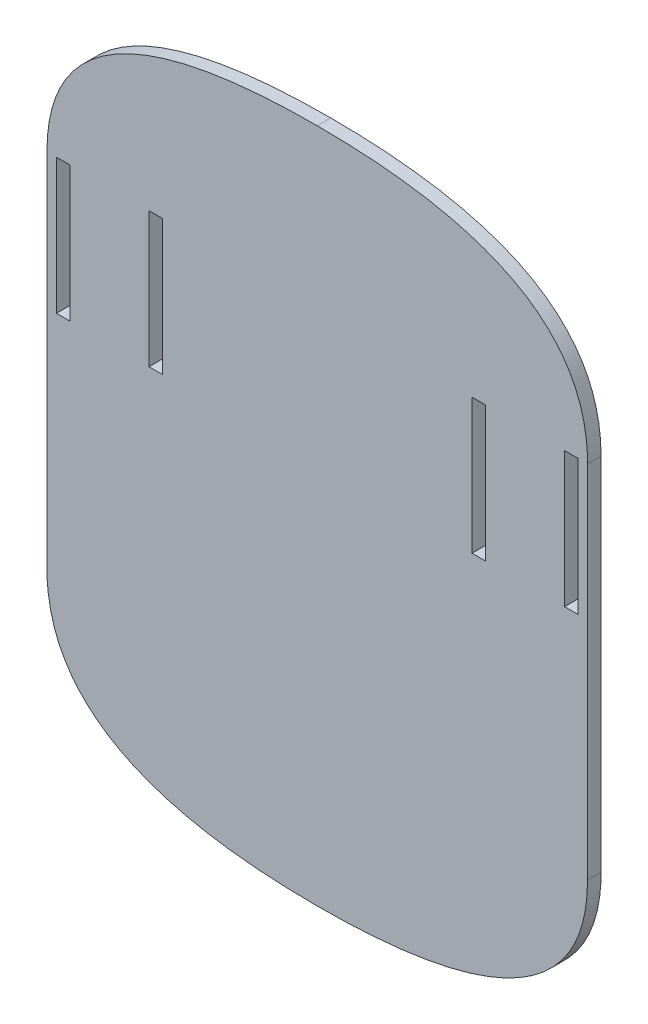
ISO-10303-21;
HEADER;
FILE_DESCRIPTION(('STEP AP214'),'2;1');
FILE_NAME('part.step','',(''),(''),'','','');
FILE_SCHEMA(('AUTOMOTIVE_DESIGN { 1 0 10303 214 1 1 1 1 }'));
ENDSEC;
DATA;
#1=APPLICATION_CONTEXT('core data for automotive mechanical design processes');
#2=APPLICATION_PROTOCOL_DEFINITION('international standard','automotive_design',2000,#1);
#3=PRODUCT_CONTEXT('',#1,'mechanical');
#4=PRODUCT('Part','Part','',(#3));
#5=PRODUCT_RELATED_PRODUCT_CATEGORY('part','',(#4));
#6=PRODUCT_DEFINITION_FORMATION('','',#4);
#7=PRODUCT_DEFINITION_CONTEXT('part definition',#1,'design');
#8=PRODUCT_DEFINITION('design','',#6,#7);
#9=PRODUCT_DEFINITION_SHAPE('','',#8);
#10=(LENGTH_UNIT() NAMED_UNIT(*) SI_UNIT(.MILLI.,.METRE.));
#11=(NAMED_UNIT(*) PLANE_ANGLE_UNIT() SI_UNIT($,.RADIAN.));
#12=(NAMED_UNIT(*) SI_UNIT($,.STERADIAN.) SOLID_ANGLE_UNIT());
#13=UNCERTAINTY_MEASURE_WITH_UNIT(LENGTH_MEASURE(1.E-05),#10,'distance_accuracy_value','');
#14=(GEOMETRIC_REPRESENTATION_CONTEXT(3) GLOBAL_UNCERTAINTY_ASSIGNED_CONTEXT((#13)) GLOBAL_UNIT_ASSIGNED_CONTEXT((#10,
#11,#12)) REPRESENTATION_CONTEXT('',''));
#15=CARTESIAN_POINT('',(0.,0.,0.));
#16=DIRECTION('',(0.,0.,1.));
#17=DIRECTION('',(1.,0.,0.));
#18=AXIS2_PLACEMENT_3D('',#15,#16,#17);
#19=CARTESIAN_POINT('',(0.,0.,5.08));
#20=DIRECTION('',(1.,0.,0.));
#21=DIRECTION('',(0.,0.,-1.));
#22=AXIS2_PLACEMENT_3D('',#19,#20,#21);
#23=PLANE('',#22);
#24=DIRECTION('',(0.,-1.,0.));
#25=VECTOR('',#24,1.);
#26=CARTESIAN_POINT('',(0.,0.,0.));
#27=LINE('',#26,#25);
#28=CARTESIAN_POINT('',(0.,194.733333333333,0.));
#29=VERTEX_POINT('',#28);
#30=CARTESIAN_POINT('',(0.,59.2666666666667,0.));
#31=VERTEX_POINT('',#30);
#32=EDGE_CURVE('E705',#29,#31,#27,.T.);
#33=ORIENTED_EDGE('',*,*,#32,.T.);
#34=CARTESIAN_POINT('',(0.,59.2666666666667,5.334));
#35=CARTESIAN_POINT('',(0.,59.2666666666667,3.47133333333333));
#36=CARTESIAN_POINT('',(0.,59.2666666666667,1.60866666666667));
#37=CARTESIAN_POINT('',(0.,59.2666666666667,-0.254));
#38=(BOUNDED_CURVE() B_SPLINE_CURVE(3,(#34,#35,#36,#37),.UNSPECIFIED.,.F.,
.F.) B_SPLINE_CURVE_WITH_KNOTS((4,4),(-0.000254,0.005334),
.UNSPECIFIED.) CURVE() GEOMETRIC_REPRESENTATION_ITEM() RATIONAL_B_SPLINE_CURVE((1.,1.,1.,1.)) REPRESENTATION_ITEM(''));
#39=CARTESIAN_POINT('',(0.,59.2666666666667,5.08));
#40=VERTEX_POINT('',#39);
#41=EDGE_CURVE('E574',#31,#40,#38,.F.);
#42=ORIENTED_EDGE('',*,*,#41,.T.);
#43=DIRECTION('',(0.,-1.,0.));
#44=VECTOR('',#43,1.);
#45=CARTESIAN_POINT('',(0.,0.,5.08));
#46=LINE('',#45,#44);
#47=CARTESIAN_POINT('',(0.,194.733333333333,5.08));
#48=VERTEX_POINT('',#47);
#49=EDGE_CURVE('E289',#48,#40,#46,.T.);
#50=ORIENTED_EDGE('',*,*,#49,.F.);
#51=CARTESIAN_POINT('',(0.,194.733333333333,-0.254));
#52=CARTESIAN_POINT('',(0.,194.733333333333,1.60866666666667));
#53=CARTESIAN_POINT('',(0.,194.733333333333,3.47133333333333));
#54=CARTESIAN_POINT('',(0.,194.733333333333,5.334));
#55=(BOUNDED_CURVE() B_SPLINE_CURVE(3,(#51,#52,#53,#54),.UNSPECIFIED.,.F.,
.F.) B_SPLINE_CURVE_WITH_KNOTS((4,4),(-0.000254,0.005334),
.UNSPECIFIED.) CURVE() GEOMETRIC_REPRESENTATION_ITEM() RATIONAL_B_SPLINE_CURVE((1.,1.,1.,1.)) REPRESENTATION_ITEM(''));
#56=EDGE_CURVE('E355',#48,#29,#55,.F.);
#57=ORIENTED_EDGE('',*,*,#56,.T.);
#58=EDGE_LOOP('',(#33,#42,#50,#57));
#59=FACE_BOUND('',#58,.T.);
#60=ADVANCED_FACE('F40',(#59),#23,.F.);
#61=CARTESIAN_POINT('',(203.2,0.,5.08));
#62=DIRECTION('',(-1.,0.,0.));
#63=DIRECTION('',(0.,0.,1.));
#64=AXIS2_PLACEMENT_3D('',#61,#62,#63);
#65=PLANE('',#64);
#66=DIRECTION('',(0.,1.,0.));
#67=VECTOR('',#66,1.);
#68=CARTESIAN_POINT('',(203.2,0.,5.08));
#69=LINE('',#68,#67);
#70=CARTESIAN_POINT('',(203.2,59.2666666666667,5.08));
#71=VERTEX_POINT('',#70);
#72=CARTESIAN_POINT('',(203.2,194.733333333333,5.08));
#73=VERTEX_POINT('',#72);
#74=EDGE_CURVE('E293',#71,#73,#69,.T.);
#75=ORIENTED_EDGE('',*,*,#74,.F.);
#76=CARTESIAN_POINT('',(203.2,59.2666666666667,-0.254));
#77=CARTESIAN_POINT('',(203.2,59.2666666666667,1.60866666666667));
#78=CARTESIAN_POINT('',(203.2,59.2666666666667,3.47133333333333));
#79=CARTESIAN_POINT('',(203.2,59.2666666666667,5.334));
#80=(BOUNDED_CURVE() B_SPLINE_CURVE(3,(#76,#77,#78,#79),.UNSPECIFIED.,.F.,
.F.) B_SPLINE_CURVE_WITH_KNOTS((4,4),(-0.000254,0.005334),
.UNSPECIFIED.) CURVE() GEOMETRIC_REPRESENTATION_ITEM() RATIONAL_B_SPLINE_CURVE((1.,1.,1.,1.)) REPRESENTATION_ITEM(''));
#81=CARTESIAN_POINT('',(203.2,59.2666666666667,0.));
#82=VERTEX_POINT('',#81);
#83=EDGE_CURVE('E401',#71,#82,#80,.F.);
#84=ORIENTED_EDGE('',*,*,#83,.T.);
#85=DIRECTION('',(0.,1.,0.));
#86=VECTOR('',#85,1.);
#87=CARTESIAN_POINT('',(203.2,0.,0.));
#88=LINE('',#87,#86);
#89=CARTESIAN_POINT('',(203.2,194.733333333333,0.));
#90=VERTEX_POINT('',#89);
#91=EDGE_CURVE('E294',#82,#90,#88,.T.);
#92=ORIENTED_EDGE('',*,*,#91,.T.);
#93=CARTESIAN_POINT('',(203.2,194.733333333333,5.334));
#94=CARTESIAN_POINT('',(203.2,194.733333333333,3.47133333333333));
#95=CARTESIAN_POINT('',(203.2,194.733333333333,1.60866666666667));
#96=CARTESIAN_POINT('',(203.2,194.733333333333,-0.254));
#97=(BOUNDED_CURVE() B_SPLINE_CURVE(3,(#93,#94,#95,#96),.UNSPECIFIED.,.F.,
.F.) B_SPLINE_CURVE_WITH_KNOTS((4,4),(-0.000254,0.005334),
.UNSPECIFIED.) CURVE() GEOMETRIC_REPRESENTATION_ITEM() RATIONAL_B_SPLINE_CURVE((1.,1.,1.,1.)) REPRESENTATION_ITEM(''));
#98=EDGE_CURVE('E534',#90,#73,#97,.F.);
#99=ORIENTED_EDGE('',*,*,#98,.T.);
#100=EDGE_LOOP('',(#75,#84,#92,#99));
#101=FACE_BOUND('',#100,.T.);
#102=ADVANCED_FACE('F318',(#101),#65,.F.);
#103=CARTESIAN_POINT('',(0.,0.,5.08));
#104=DIRECTION('',(0.,0.,-1.));
#105=DIRECTION('',(-1.,0.,0.));
#106=AXIS2_PLACEMENT_3D('',#103,#104,#105);
#107=PLANE('',#106);
#108=DIRECTION('',(1.,0.,0.));
#109=VECTOR('',#108,1.);
#110=CARTESIAN_POINT('',(3.55600000000001,143.933333333333,5.08));
#111=LINE('',#110,#109);
#112=CARTESIAN_POINT('',(3.55600000000001,143.933333333333,5.08));
#113=VERTEX_POINT('',#112);
#114=CARTESIAN_POINT('',(8.63600000000001,143.933333333333,5.08));
#115=VERTEX_POINT('',#114);
#116=EDGE_CURVE('E209',#113,#115,#111,.T.);
#117=ORIENTED_EDGE('',*,*,#116,.F.);
#118=DIRECTION('',(0.,-1.,0.));
#119=VECTOR('',#118,1.);
#120=CARTESIAN_POINT('',(3.556,194.733333333333,5.08));
#121=LINE('',#120,#119);
#122=CARTESIAN_POINT('',(3.556,194.733333333333,5.08));
#123=VERTEX_POINT('',#122);
#124=EDGE_CURVE('E59',#123,#113,#121,.T.);
#125=ORIENTED_EDGE('',*,*,#124,.F.);
#126=DIRECTION('',(-1.,0.,0.));
#127=VECTOR('',#126,1.);
#128=CARTESIAN_POINT('',(3.556,194.733333333333,5.08));
#129=LINE('',#128,#127);
#130=CARTESIAN_POINT('',(8.636,194.733333333333,5.08));
#131=VERTEX_POINT('',#130);
#132=EDGE_CURVE('E216',#131,#123,#129,.T.);
#133=ORIENTED_EDGE('',*,*,#132,.F.);
#134=DIRECTION('',(0.,1.,0.));
#135=VECTOR('',#134,1.);
#136=CARTESIAN_POINT('',(8.636,194.733333333333,5.08));
#137=LINE('',#136,#135);
#138=EDGE_CURVE('E199',#115,#131,#137,.T.);
#139=ORIENTED_EDGE('',*,*,#138,.F.);
#140=EDGE_LOOP('',(#117,#125,#133,#139));
#141=FACE_BOUND('',#140,.T.);
#142=DIRECTION('',(1.,0.,0.));
#143=VECTOR('',#142,1.);
#144=CARTESIAN_POINT('',(159.766,143.933333333333,5.08));
#145=LINE('',#144,#143);
#146=CARTESIAN_POINT('',(159.766,143.933333333333,5.08));
#147=VERTEX_POINT('',#146);
#148=CARTESIAN_POINT('',(164.846,143.933333333333,5.08));
#149=VERTEX_POINT('',#148);
#150=EDGE_CURVE('E227',#147,#149,#145,.T.);
#151=ORIENTED_EDGE('',*,*,#150,.F.);
#152=DIRECTION('',(0.,-1.,0.));
#153=VECTOR('',#152,1.);
#154=CARTESIAN_POINT('',(159.766,194.733333333333,5.08));
#155=LINE('',#154,#153);
#156=CARTESIAN_POINT('',(159.766,194.733333333333,5.08));
#157=VERTEX_POINT('',#156);
#158=EDGE_CURVE('E67',#157,#147,#155,.T.);
#159=ORIENTED_EDGE('',*,*,#158,.F.);
#160=DIRECTION('',(-1.,0.,0.));
#161=VECTOR('',#160,1.);
#162=CARTESIAN_POINT('',(159.766,194.733333333333,5.08));
#163=LINE('',#162,#161);
#164=CARTESIAN_POINT('',(164.846,194.733333333333,5.08));
#165=VERTEX_POINT('',#164);
#166=EDGE_CURVE('E233',#165,#157,#163,.T.);
#167=ORIENTED_EDGE('',*,*,#166,.F.);
#168=DIRECTION('',(0.,1.,0.));
#169=VECTOR('',#168,1.);
#170=CARTESIAN_POINT('',(164.846,194.733333333333,5.08));
#171=LINE('',#170,#169);
#172=EDGE_CURVE('E230',#149,#165,#171,.T.);
#173=ORIENTED_EDGE('',*,*,#172,.F.);
#174=EDGE_LOOP('',(#151,#159,#167,#173));
#175=FACE_BOUND('',#174,.T.);
#176=DIRECTION('',(1.,0.,0.));
#177=VECTOR('',#176,1.);
#178=CARTESIAN_POINT('',(38.354,143.933333333333,5.08));
#179=LINE('',#178,#177);
#180=CARTESIAN_POINT('',(38.354,143.933333333333,5.08));
#181=VERTEX_POINT('',#180);
#182=CARTESIAN_POINT('',(43.434,143.933333333333,5.08));
#183=VERTEX_POINT('',#182);
#184=EDGE_CURVE('E267',#181,#183,#179,.T.);
#185=ORIENTED_EDGE('',*,*,#184,.F.);
#186=DIRECTION('',(0.,-1.,0.));
#187=VECTOR('',#186,1.);
#188=CARTESIAN_POINT('',(38.354,194.733333333333,5.08));
#189=LINE('',#188,#187);
#190=CARTESIAN_POINT('',(38.354,194.733333333333,5.08));
#191=VERTEX_POINT('',#190);
#192=EDGE_CURVE('E239',#191,#181,#189,.T.);
#193=ORIENTED_EDGE('',*,*,#192,.F.);
#194=DIRECTION('',(-1.,0.,0.));
#195=VECTOR('',#194,1.);
#196=CARTESIAN_POINT('',(38.354,194.733333333333,5.08));
#197=LINE('',#196,#195);
#198=CARTESIAN_POINT('',(43.434,194.733333333333,5.08));
#199=VERTEX_POINT('',#198);
#200=EDGE_CURVE('E273',#199,#191,#197,.T.);
#201=ORIENTED_EDGE('',*,*,#200,.F.);
#202=DIRECTION('',(0.,1.,0.));
#203=VECTOR('',#202,1.);
#204=CARTESIAN_POINT('',(43.434,194.733333333333,5.08));
#205=LINE('',#204,#203);
#206=EDGE_CURVE('E270',#183,#199,#205,.T.);
#207=ORIENTED_EDGE('',*,*,#206,.F.);
#208=EDGE_LOOP('',(#185,#193,#201,#207));
#209=FACE_BOUND('',#208,.T.);
#210=DIRECTION('',(1.,0.,0.));
#211=VECTOR('',#210,1.);
#212=CARTESIAN_POINT('',(194.564,143.933333333333,5.08));
#213=LINE('',#212,#211);
#214=CARTESIAN_POINT('',(194.564,143.933333333333,5.08));
#215=VERTEX_POINT('',#214);
#216=CARTESIAN_POINT('',(199.644,143.933333333333,5.08));
#217=VERTEX_POINT('',#216);
#218=EDGE_CURVE('E247',#215,#217,#213,.T.);
#219=ORIENTED_EDGE('',*,*,#218,.F.);
#220=DIRECTION('',(0.,-1.,0.));
#221=VECTOR('',#220,1.);
#222=CARTESIAN_POINT('',(194.564,194.733333333333,5.08));
#223=LINE('',#222,#221);
#224=CARTESIAN_POINT('',(194.564,194.733333333333,5.08));
#225=VERTEX_POINT('',#224);
#226=EDGE_CURVE('E245',#225,#215,#223,.T.);
#227=ORIENTED_EDGE('',*,*,#226,.F.);
#228=DIRECTION('',(-1.,0.,0.));
#229=VECTOR('',#228,1.);
#230=CARTESIAN_POINT('',(194.564,194.733333333333,5.08));
#231=LINE('',#230,#229);
#232=CARTESIAN_POINT('',(199.644,194.733333333333,5.08));
#233=VERTEX_POINT('',#232);
#234=EDGE_CURVE('E254',#233,#225,#231,.T.);
#235=ORIENTED_EDGE('',*,*,#234,.F.);
#236=DIRECTION('',(0.,1.,0.));
#237=VECTOR('',#236,1.);
#238=CARTESIAN_POINT('',(199.644,194.733333333333,5.08));
#239=LINE('',#238,#237);
#240=EDGE_CURVE('E251',#217,#233,#239,.T.);
#241=ORIENTED_EDGE('',*,*,#240,.F.);
#242=EDGE_LOOP('',(#219,#227,#235,#241));
#243=FACE_BOUND('',#242,.T.);
#244=CARTESIAN_POINT('',(101.6,0.,5.08));
#245=CARTESIAN_POINT('',(0.,0.,5.08));
#246=CARTESIAN_POINT('',(0.,59.2666666666667,5.08));
#247=(BOUNDED_CURVE() B_SPLINE_CURVE(2,(#244,#245,#246),.UNSPECIFIED.,.F.,
.F.) B_SPLINE_CURVE_WITH_KNOTS((3,3),(0.,1.),
.UNSPECIFIED.) CURVE() GEOMETRIC_REPRESENTATION_ITEM() RATIONAL_B_SPLINE_CURVE((1.,1.,1.)) REPRESENTATION_ITEM(''));
#248=CARTESIAN_POINT('',(101.6,0.,5.08));
#249=VERTEX_POINT('',#248);
#250=EDGE_CURVE('E680',#40,#249,#247,.F.);
#251=ORIENTED_EDGE('',*,*,#250,.T.);
#252=CARTESIAN_POINT('',(203.2,59.2666666666667,5.08));
#253=CARTESIAN_POINT('',(203.2,0.,5.08));
#254=CARTESIAN_POINT('',(101.6,0.,5.08));
#255=(BOUNDED_CURVE() B_SPLINE_CURVE(2,(#252,#253,#254),.UNSPECIFIED.,.F.,
.F.) B_SPLINE_CURVE_WITH_KNOTS((3,3),(0.,1.),
.UNSPECIFIED.) CURVE() GEOMETRIC_REPRESENTATION_ITEM() RATIONAL_B_SPLINE_CURVE((1.,1.,1.)) REPRESENTATION_ITEM(''));
#256=EDGE_CURVE('E341',#249,#71,#255,.F.);
#257=ORIENTED_EDGE('',*,*,#256,.T.);
#258=ORIENTED_EDGE('',*,*,#74,.T.);
#259=CARTESIAN_POINT('',(101.6,254.,5.08));
#260=CARTESIAN_POINT('',(203.2,254.,5.08));
#261=CARTESIAN_POINT('',(203.2,194.733333333333,5.08));
#262=(BOUNDED_CURVE() B_SPLINE_CURVE(2,(#259,#260,#261),.UNSPECIFIED.,.F.,
.F.) B_SPLINE_CURVE_WITH_KNOTS((3,3),(0.,1.),
.UNSPECIFIED.) CURVE() GEOMETRIC_REPRESENTATION_ITEM() RATIONAL_B_SPLINE_CURVE((1.,1.,1.)) REPRESENTATION_ITEM(''));
#263=CARTESIAN_POINT('',(101.6,254.,5.08));
#264=VERTEX_POINT('',#263);
#265=EDGE_CURVE('E523',#73,#264,#262,.F.);
#266=ORIENTED_EDGE('',*,*,#265,.T.);
#267=CARTESIAN_POINT('',(0.,194.733333333333,5.08));
#268=CARTESIAN_POINT('',(0.,254.,5.08));
#269=CARTESIAN_POINT('',(101.6,254.,5.08));
#270=(BOUNDED_CURVE() B_SPLINE_CURVE(2,(#267,#268,#269),.UNSPECIFIED.,.F.,
.F.) B_SPLINE_CURVE_WITH_KNOTS((3,3),(0.,1.),
.UNSPECIFIED.) CURVE() GEOMETRIC_REPRESENTATION_ITEM() RATIONAL_B_SPLINE_CURVE((1.,1.,1.)) REPRESENTATION_ITEM(''));
#271=EDGE_CURVE('E302',#264,#48,#270,.F.);
#272=ORIENTED_EDGE('',*,*,#271,.T.);
#273=ORIENTED_EDGE('',*,*,#49,.T.);
#274=EDGE_LOOP('',(#251,#257,#258,#266,#272,#273));
#275=FACE_BOUND('',#274,.T.);
#276=ADVANCED_FACE('F213',(#141,#175,#209,#243,#275),#107,.F.);
#277=CARTESIAN_POINT('',(0.,0.,0.));
#278=DIRECTION('',(0.,0.,-1.));
#279=DIRECTION('',(-1.,0.,0.));
#280=AXIS2_PLACEMENT_3D('',#277,#278,#279);
#281=PLANE('',#280);
#282=DIRECTION('',(0.,1.,0.));
#283=VECTOR('',#282,1.);
#284=CARTESIAN_POINT('',(3.55600000000002,0.,0.));
#285=LINE('',#284,#283);
#286=CARTESIAN_POINT('',(3.55600000000001,143.933333333333,0.));
#287=VERTEX_POINT('',#286);
#288=CARTESIAN_POINT('',(3.556,194.733333333333,0.));
#289=VERTEX_POINT('',#288);
#290=EDGE_CURVE('E12',#287,#289,#285,.T.);
#291=ORIENTED_EDGE('',*,*,#290,.F.);
#292=DIRECTION('',(-1.,0.,0.));
#293=VECTOR('',#292,1.);
#294=CARTESIAN_POINT('',(0.,143.933333333333,0.));
#295=LINE('',#294,#293);
#296=CARTESIAN_POINT('',(8.63600000000001,143.933333333333,0.));
#297=VERTEX_POINT('',#296);
#298=EDGE_CURVE('E599',#297,#287,#295,.T.);
#299=ORIENTED_EDGE('',*,*,#298,.F.);
#300=DIRECTION('',(0.,-1.,0.));
#301=VECTOR('',#300,1.);
#302=CARTESIAN_POINT('',(8.63600000000003,0.,0.));
#303=LINE('',#302,#301);
#304=CARTESIAN_POINT('',(8.636,194.733333333333,0.));
#305=VERTEX_POINT('',#304);
#306=EDGE_CURVE('E202',#305,#297,#303,.T.);
#307=ORIENTED_EDGE('',*,*,#306,.F.);
#308=DIRECTION('',(1.,0.,0.));
#309=VECTOR('',#308,1.);
#310=CARTESIAN_POINT('',(0.,194.733333333333,0.));
#311=LINE('',#310,#309);
#312=EDGE_CURVE('E52',#289,#305,#311,.T.);
#313=ORIENTED_EDGE('',*,*,#312,.F.);
#314=EDGE_LOOP('',(#291,#299,#307,#313));
#315=FACE_BOUND('',#314,.T.);
#316=DIRECTION('',(0.,1.,0.));
#317=VECTOR('',#316,1.);
#318=CARTESIAN_POINT('',(159.766,0.,0.));
#319=LINE('',#318,#317);
#320=CARTESIAN_POINT('',(159.766,143.933333333333,0.));
#321=VERTEX_POINT('',#320);
#322=CARTESIAN_POINT('',(159.766,194.733333333333,0.));
#323=VERTEX_POINT('',#322);
#324=EDGE_CURVE('E597',#321,#323,#319,.T.);
#325=ORIENTED_EDGE('',*,*,#324,.F.);
#326=DIRECTION('',(-1.,0.,0.));
#327=VECTOR('',#326,1.);
#328=CARTESIAN_POINT('',(0.,143.933333333333,0.));
#329=LINE('',#328,#327);
#330=CARTESIAN_POINT('',(164.846,143.933333333333,0.));
#331=VERTEX_POINT('',#330);
#332=EDGE_CURVE('E590',#331,#321,#329,.T.);
#333=ORIENTED_EDGE('',*,*,#332,.F.);
#334=DIRECTION('',(0.,-1.,0.));
#335=VECTOR('',#334,1.);
#336=CARTESIAN_POINT('',(164.846,0.,0.));
#337=LINE('',#336,#335);
#338=CARTESIAN_POINT('',(164.846,194.733333333333,0.));
#339=VERTEX_POINT('',#338);
#340=EDGE_CURVE('E592',#339,#331,#337,.T.);
#341=ORIENTED_EDGE('',*,*,#340,.F.);
#342=DIRECTION('',(1.,0.,0.));
#343=VECTOR('',#342,1.);
#344=CARTESIAN_POINT('',(0.,194.733333333333,0.));
#345=LINE('',#344,#343);
#346=EDGE_CURVE('E595',#323,#339,#345,.T.);
#347=ORIENTED_EDGE('',*,*,#346,.F.);
#348=EDGE_LOOP('',(#325,#333,#341,#347));
#349=FACE_BOUND('',#348,.T.);
#350=DIRECTION('',(0.,1.,0.));
#351=VECTOR('',#350,1.);
#352=CARTESIAN_POINT('',(38.354,0.,0.));
#353=LINE('',#352,#351);
#354=CARTESIAN_POINT('',(38.354,143.933333333333,0.));
#355=VERTEX_POINT('',#354);
#356=CARTESIAN_POINT('',(38.354,194.733333333333,0.));
#357=VERTEX_POINT('',#356);
#358=EDGE_CURVE('E588',#355,#357,#353,.T.);
#359=ORIENTED_EDGE('',*,*,#358,.F.);
#360=DIRECTION('',(-1.,0.,0.));
#361=VECTOR('',#360,1.);
#362=CARTESIAN_POINT('',(0.,143.933333333333,0.));
#363=LINE('',#362,#361);
#364=CARTESIAN_POINT('',(43.434,143.933333333333,0.));
#365=VERTEX_POINT('',#364);
#366=EDGE_CURVE('E581',#365,#355,#363,.T.);
#367=ORIENTED_EDGE('',*,*,#366,.F.);
#368=DIRECTION('',(0.,-1.,0.));
#369=VECTOR('',#368,1.);
#370=CARTESIAN_POINT('',(43.434,0.,0.));
#371=LINE('',#370,#369);
#372=CARTESIAN_POINT('',(43.434,194.733333333333,0.));
#373=VERTEX_POINT('',#372);
#374=EDGE_CURVE('E583',#373,#365,#371,.T.);
#375=ORIENTED_EDGE('',*,*,#374,.F.);
#376=DIRECTION('',(1.,0.,0.));
#377=VECTOR('',#376,1.);
#378=CARTESIAN_POINT('',(0.,194.733333333333,0.));
#379=LINE('',#378,#377);
#380=EDGE_CURVE('E586',#357,#373,#379,.T.);
#381=ORIENTED_EDGE('',*,*,#380,.F.);
#382=EDGE_LOOP('',(#359,#367,#375,#381));
#383=FACE_BOUND('',#382,.T.);
#384=DIRECTION('',(0.,1.,0.));
#385=VECTOR('',#384,1.);
#386=CARTESIAN_POINT('',(194.564,0.,0.));
#387=LINE('',#386,#385);
#388=CARTESIAN_POINT('',(194.564,143.933333333333,0.));
#389=VERTEX_POINT('',#388);
#390=CARTESIAN_POINT('',(194.564,194.733333333333,0.));
#391=VERTEX_POINT('',#390);
#392=EDGE_CURVE('E579',#389,#391,#387,.T.);
#393=ORIENTED_EDGE('',*,*,#392,.F.);
#394=DIRECTION('',(-1.,0.,0.));
#395=VECTOR('',#394,1.);
#396=CARTESIAN_POINT('',(0.,143.933333333333,0.));
#397=LINE('',#396,#395);
#398=CARTESIAN_POINT('',(199.644,143.933333333333,0.));
#399=VERTEX_POINT('',#398);
#400=EDGE_CURVE('E566',#399,#389,#397,.T.);
#401=ORIENTED_EDGE('',*,*,#400,.F.);
#402=DIRECTION('',(0.,-1.,0.));
#403=VECTOR('',#402,1.);
#404=CARTESIAN_POINT('',(199.644,0.,0.));
#405=LINE('',#404,#403);
#406=CARTESIAN_POINT('',(199.644,194.733333333333,0.));
#407=VERTEX_POINT('',#406);
#408=EDGE_CURVE('E573',#407,#399,#405,.T.);
#409=ORIENTED_EDGE('',*,*,#408,.F.);
#410=DIRECTION('',(1.,0.,0.));
#411=VECTOR('',#410,1.);
#412=CARTESIAN_POINT('',(0.,194.733333333333,0.));
#413=LINE('',#412,#411);
#414=EDGE_CURVE('E577',#391,#407,#413,.T.);
#415=ORIENTED_EDGE('',*,*,#414,.F.);
#416=EDGE_LOOP('',(#393,#401,#409,#415));
#417=FACE_BOUND('',#416,.T.);
#418=ORIENTED_EDGE('',*,*,#91,.F.);
#419=CARTESIAN_POINT('',(101.6,0.,0.));
#420=CARTESIAN_POINT('',(203.2,0.,0.));
#421=CARTESIAN_POINT('',(203.2,59.2666666666667,0.));
#422=(BOUNDED_CURVE() B_SPLINE_CURVE(2,(#419,#420,#421),.UNSPECIFIED.,.F.,
.F.) B_SPLINE_CURVE_WITH_KNOTS((3,3),(0.,1.),
.UNSPECIFIED.) CURVE() GEOMETRIC_REPRESENTATION_ITEM() RATIONAL_B_SPLINE_CURVE((1.,1.,1.)) REPRESENTATION_ITEM(''));
#423=CARTESIAN_POINT('',(101.6,0.,0.));
#424=VERTEX_POINT('',#423);
#425=EDGE_CURVE('E390',#82,#424,#422,.F.);
#426=ORIENTED_EDGE('',*,*,#425,.T.);
#427=CARTESIAN_POINT('',(0.,59.2666666666667,0.));
#428=CARTESIAN_POINT('',(0.,0.,0.));
#429=CARTESIAN_POINT('',(101.6,0.,0.));
#430=(BOUNDED_CURVE() B_SPLINE_CURVE(2,(#427,#428,#429),.UNSPECIFIED.,.F.,
.F.) B_SPLINE_CURVE_WITH_KNOTS((3,3),(0.,1.),
.UNSPECIFIED.) CURVE() GEOMETRIC_REPRESENTATION_ITEM() RATIONAL_B_SPLINE_CURVE((1.,1.,1.)) REPRESENTATION_ITEM(''));
#431=EDGE_CURVE('E478',#424,#31,#430,.F.);
#432=ORIENTED_EDGE('',*,*,#431,.T.);
#433=ORIENTED_EDGE('',*,*,#32,.F.);
#434=CARTESIAN_POINT('',(101.6,254.,0.));
#435=CARTESIAN_POINT('',(0.,254.,0.));
#436=CARTESIAN_POINT('',(0.,194.733333333333,0.));
#437=(BOUNDED_CURVE() B_SPLINE_CURVE(2,(#434,#435,#436),.UNSPECIFIED.,.F.,
.F.) B_SPLINE_CURVE_WITH_KNOTS((3,3),(0.,1.),
.UNSPECIFIED.) CURVE() GEOMETRIC_REPRESENTATION_ITEM() RATIONAL_B_SPLINE_CURVE((1.,1.,1.)) REPRESENTATION_ITEM(''));
#438=CARTESIAN_POINT('',(101.6,254.,0.));
#439=VERTEX_POINT('',#438);
#440=EDGE_CURVE('E544',#29,#439,#437,.F.);
#441=ORIENTED_EDGE('',*,*,#440,.T.);
#442=CARTESIAN_POINT('',(203.2,194.733333333333,0.));
#443=CARTESIAN_POINT('',(203.2,254.,0.));
#444=CARTESIAN_POINT('',(101.6,254.,0.));
#445=(BOUNDED_CURVE() B_SPLINE_CURVE(2,(#442,#443,#444),.UNSPECIFIED.,.F.,
.F.) B_SPLINE_CURVE_WITH_KNOTS((3,3),(0.,1.),
.UNSPECIFIED.) CURVE() GEOMETRIC_REPRESENTATION_ITEM() RATIONAL_B_SPLINE_CURVE((1.,1.,1.)) REPRESENTATION_ITEM(''));
#446=EDGE_CURVE('E492',#439,#90,#445,.F.);
#447=ORIENTED_EDGE('',*,*,#446,.T.);
#448=EDGE_LOOP('',(#418,#426,#432,#433,#441,#447));
#449=FACE_BOUND('',#448,.T.);
#450=ADVANCED_FACE('F317',(#315,#349,#383,#417,#449),#281,.T.);
#451=CARTESIAN_POINT('',(101.6,0.,5.334));
#452=CARTESIAN_POINT('',(101.6,0.,3.47133333333333));
#453=CARTESIAN_POINT('',(101.6,0.,1.60866666666667));
#454=CARTESIAN_POINT('',(101.6,0.,-0.254));
#455=CARTESIAN_POINT('',(0.,0.,5.334));
#456=CARTESIAN_POINT('',(0.,0.,3.47133333333334));
#457=CARTESIAN_POINT('',(0.,0.,1.60866666666667));
#458=CARTESIAN_POINT('',(0.,0.,-0.254));
#459=CARTESIAN_POINT('',(0.,59.2666666666667,5.334));
#460=CARTESIAN_POINT('',(0.,59.2666666666667,3.47133333333333));
#461=CARTESIAN_POINT('',(0.,59.2666666666667,1.60866666666667));
#462=CARTESIAN_POINT('',(0.,59.2666666666667,-0.254));
#463=(BOUNDED_SURFACE() B_SPLINE_SURFACE(2,3,((#451,#452,#453,#454),(#455,#456,#457,#458),(#459,
#460,#461,#462)),.UNSPECIFIED.,.F.,.F.,.F.) B_SPLINE_SURFACE_WITH_KNOTS((3,3),(4,4),(0.,1.),
(-0.000254,0.005334),
.UNSPECIFIED.) GEOMETRIC_REPRESENTATION_ITEM() RATIONAL_B_SPLINE_SURFACE(((1.,1.,1.,1.),(1.,1.,
1.,1.),(1.,1.,1.,1.))) REPRESENTATION_ITEM('') SURFACE());
#464=CARTESIAN_POINT('',(101.6,0.,5.334));
#465=CARTESIAN_POINT('',(101.6,0.,3.47133333333333));
#466=CARTESIAN_POINT('',(101.6,0.,1.60866666666667));
#467=CARTESIAN_POINT('',(101.6,0.,-0.254));
#468=(BOUNDED_CURVE() B_SPLINE_CURVE(3,(#464,#465,#466,#467),.UNSPECIFIED.,.F.,
.F.) B_SPLINE_CURVE_WITH_KNOTS((4,4),(-0.000254,0.005334),
.UNSPECIFIED.) CURVE() GEOMETRIC_REPRESENTATION_ITEM() RATIONAL_B_SPLINE_CURVE((1.,1.,1.,1.)) REPRESENTATION_ITEM(''));
#469=EDGE_CURVE('E421',#249,#424,#468,.T.);
#470=ORIENTED_EDGE('',*,*,#469,.F.);
#471=ORIENTED_EDGE('',*,*,#250,.F.);
#472=ORIENTED_EDGE('',*,*,#41,.F.);
#473=ORIENTED_EDGE('',*,*,#431,.F.);
#474=EDGE_LOOP('',(#470,#471,#472,#473));
#475=FACE_BOUND('',#474,.T.);
#476=ADVANCED_FACE('F439',(#475),#463,.T.);
#477=CARTESIAN_POINT('',(203.2,59.2666666666667,5.334));
#478=CARTESIAN_POINT('',(203.2,59.2666666666667,3.47133333333333));
#479=CARTESIAN_POINT('',(203.2,59.2666666666667,1.60866666666667));
#480=CARTESIAN_POINT('',(203.2,59.2666666666667,-0.254));
#481=CARTESIAN_POINT('',(203.2,0.,5.334));
#482=CARTESIAN_POINT('',(203.2,0.,3.47133333333334));
#483=CARTESIAN_POINT('',(203.2,0.,1.60866666666667));
#484=CARTESIAN_POINT('',(203.2,0.,-0.254));
#485=CARTESIAN_POINT('',(101.6,0.,5.334));
#486=CARTESIAN_POINT('',(101.6,0.,3.47133333333333));
#487=CARTESIAN_POINT('',(101.6,0.,1.60866666666667));
#488=CARTESIAN_POINT('',(101.6,0.,-0.254));
#489=(BOUNDED_SURFACE() B_SPLINE_SURFACE(2,3,((#477,#478,#479,#480),(#481,#482,#483,#484),(#485,
#486,#487,#488)),.UNSPECIFIED.,.F.,.F.,.F.) B_SPLINE_SURFACE_WITH_KNOTS((3,3),(4,4),(0.,1.),
(-0.000254,0.005334),
.UNSPECIFIED.) GEOMETRIC_REPRESENTATION_ITEM() RATIONAL_B_SPLINE_SURFACE(((1.,1.,1.,1.),(1.,1.,
1.,1.),(1.,1.,1.,1.))) REPRESENTATION_ITEM('') SURFACE());
#490=ORIENTED_EDGE('',*,*,#256,.F.);
#491=ORIENTED_EDGE('',*,*,#469,.T.);
#492=ORIENTED_EDGE('',*,*,#425,.F.);
#493=ORIENTED_EDGE('',*,*,#83,.F.);
#494=EDGE_LOOP('',(#490,#491,#492,#493));
#495=FACE_BOUND('',#494,.T.);
#496=ADVANCED_FACE('F372',(#495),#489,.T.);
#497=CARTESIAN_POINT('',(0.,194.733333333333,5.334));
#498=CARTESIAN_POINT('',(0.,194.733333333333,3.47133333333333));
#499=CARTESIAN_POINT('',(0.,194.733333333333,1.60866666666667));
#500=CARTESIAN_POINT('',(0.,194.733333333333,-0.254));
#501=CARTESIAN_POINT('',(0.,254.,5.334));
#502=CARTESIAN_POINT('',(0.,254.,3.47133333333334));
#503=CARTESIAN_POINT('',(0.,254.,1.60866666666667));
#504=CARTESIAN_POINT('',(0.,254.,-0.254));
#505=CARTESIAN_POINT('',(101.6,254.,5.334));
#506=CARTESIAN_POINT('',(101.6,254.,3.47133333333333));
#507=CARTESIAN_POINT('',(101.6,254.,1.60866666666667));
#508=CARTESIAN_POINT('',(101.6,254.,-0.254));
#509=(BOUNDED_SURFACE() B_SPLINE_SURFACE(2,3,((#497,#498,#499,#500),(#501,#502,#503,#504),(#505,
#506,#507,#508)),.UNSPECIFIED.,.F.,.F.,.F.) B_SPLINE_SURFACE_WITH_KNOTS((3,3),(4,4),(0.,1.),
(-0.000254,0.005334),
.UNSPECIFIED.) GEOMETRIC_REPRESENTATION_ITEM() RATIONAL_B_SPLINE_SURFACE(((1.,1.,1.,1.),(1.,1.,
1.,1.),(1.,1.,1.,1.))) REPRESENTATION_ITEM('') SURFACE());
#510=CARTESIAN_POINT('',(101.6,254.,-0.254));
#511=CARTESIAN_POINT('',(101.6,254.,1.60866666666667));
#512=CARTESIAN_POINT('',(101.6,254.,3.47133333333333));
#513=CARTESIAN_POINT('',(101.6,254.,5.334));
#514=(BOUNDED_CURVE() B_SPLINE_CURVE(3,(#510,#511,#512,#513),.UNSPECIFIED.,.F.,
.F.) B_SPLINE_CURVE_WITH_KNOTS((4,4),(-0.000254,0.005334),
.UNSPECIFIED.) CURVE() GEOMETRIC_REPRESENTATION_ITEM() RATIONAL_B_SPLINE_CURVE((1.,1.,1.,1.)) REPRESENTATION_ITEM(''));
#515=EDGE_CURVE('E223',#439,#264,#514,.T.);
#516=ORIENTED_EDGE('',*,*,#56,.F.);
#517=ORIENTED_EDGE('',*,*,#271,.F.);
#518=ORIENTED_EDGE('',*,*,#515,.F.);
#519=ORIENTED_EDGE('',*,*,#440,.F.);
#520=EDGE_LOOP('',(#516,#517,#518,#519));
#521=FACE_BOUND('',#520,.T.);
#522=ADVANCED_FACE('F43',(#521),#509,.T.);
#523=CARTESIAN_POINT('',(101.6,254.,5.334));
#524=CARTESIAN_POINT('',(101.6,254.,3.47133333333333));
#525=CARTESIAN_POINT('',(101.6,254.,1.60866666666667));
#526=CARTESIAN_POINT('',(101.6,254.,-0.254));
#527=CARTESIAN_POINT('',(203.2,254.,5.334));
#528=CARTESIAN_POINT('',(203.2,254.,3.47133333333334));
#529=CARTESIAN_POINT('',(203.2,254.,1.60866666666667));
#530=CARTESIAN_POINT('',(203.2,254.,-0.254));
#531=CARTESIAN_POINT('',(203.2,194.733333333333,5.334));
#532=CARTESIAN_POINT('',(203.2,194.733333333333,3.47133333333333));
#533=CARTESIAN_POINT('',(203.2,194.733333333333,1.60866666666667));
#534=CARTESIAN_POINT('',(203.2,194.733333333333,-0.254));
#535=(BOUNDED_SURFACE() B_SPLINE_SURFACE(2,3,((#523,#524,#525,#526),(#527,#528,#529,#530),(#531,
#532,#533,#534)),.UNSPECIFIED.,.F.,.F.,.F.) B_SPLINE_SURFACE_WITH_KNOTS((3,3),(4,4),(0.,1.),
(-0.000254,0.005334),
.UNSPECIFIED.) GEOMETRIC_REPRESENTATION_ITEM() RATIONAL_B_SPLINE_SURFACE(((1.,1.,1.,1.),(1.,1.,
1.,1.),(1.,1.,1.,1.))) REPRESENTATION_ITEM('') SURFACE());
#536=ORIENTED_EDGE('',*,*,#265,.F.);
#537=ORIENTED_EDGE('',*,*,#98,.F.);
#538=ORIENTED_EDGE('',*,*,#446,.F.);
#539=ORIENTED_EDGE('',*,*,#515,.T.);
#540=EDGE_LOOP('',(#536,#537,#538,#539));
#541=FACE_BOUND('',#540,.T.);
#542=ADVANCED_FACE('F452',(#541),#535,.T.);
#543=CARTESIAN_POINT('',(194.564,194.733333333333,-0.402166666666668));
#544=DIRECTION('',(-1.,0.,0.));
#545=DIRECTION('',(0.,0.,1.));
#546=AXIS2_PLACEMENT_3D('',#543,#544,#545);
#547=PLANE('',#546);
#548=ORIENTED_EDGE('',*,*,#392,.T.);
#549=DIRECTION('',(0.,0.,1.));
#550=VECTOR('',#549,1.);
#551=CARTESIAN_POINT('',(194.564,194.733333333333,-0.402166666666668));
#552=LINE('',#551,#550);
#553=EDGE_CURVE('E258',#391,#225,#552,.T.);
#554=ORIENTED_EDGE('',*,*,#553,.T.);
#555=ORIENTED_EDGE('',*,*,#226,.T.);
#556=DIRECTION('',(0.,0.,1.));
#557=VECTOR('',#556,1.);
#558=CARTESIAN_POINT('',(194.564,143.933333333333,-0.402166666666668));
#559=LINE('',#558,#557);
#560=EDGE_CURVE('E257',#389,#215,#559,.T.);
#561=ORIENTED_EDGE('',*,*,#560,.F.);
#562=EDGE_LOOP('',(#548,#554,#555,#561));
#563=FACE_BOUND('',#562,.T.);
#564=ADVANCED_FACE('F638',(#563),#547,.F.);
#565=CARTESIAN_POINT('',(194.564,194.733333333333,-0.402166666666668));
#566=DIRECTION('',(0.,1.,0.));
#567=DIRECTION('',(0.,0.,1.));
#568=AXIS2_PLACEMENT_3D('',#565,#566,#567);
#569=PLANE('',#568);
#570=ORIENTED_EDGE('',*,*,#414,.T.);
#571=DIRECTION('',(0.,0.,1.));
#572=VECTOR('',#571,1.);
#573=CARTESIAN_POINT('',(199.644,194.733333333333,-0.402166666666668));
#574=LINE('',#573,#572);
#575=EDGE_CURVE('E260',#407,#233,#574,.T.);
#576=ORIENTED_EDGE('',*,*,#575,.T.);
#577=ORIENTED_EDGE('',*,*,#234,.T.);
#578=ORIENTED_EDGE('',*,*,#553,.F.);
#579=EDGE_LOOP('',(#570,#576,#577,#578));
#580=FACE_BOUND('',#579,.T.);
#581=ADVANCED_FACE('F634',(#580),#569,.F.);
#582=CARTESIAN_POINT('',(199.644,194.733333333333,-0.402166666666668));
#583=DIRECTION('',(1.,0.,0.));
#584=DIRECTION('',(0.,0.,-1.));
#585=AXIS2_PLACEMENT_3D('',#582,#583,#584);
#586=PLANE('',#585);
#587=ORIENTED_EDGE('',*,*,#408,.T.);
#588=DIRECTION('',(0.,0.,1.));
#589=VECTOR('',#588,1.);
#590=CARTESIAN_POINT('',(199.644,143.933333333333,-0.402166666666668));
#591=LINE('',#590,#589);
#592=EDGE_CURVE('E262',#399,#217,#591,.T.);
#593=ORIENTED_EDGE('',*,*,#592,.T.);
#594=ORIENTED_EDGE('',*,*,#240,.T.);
#595=ORIENTED_EDGE('',*,*,#575,.F.);
#596=EDGE_LOOP('',(#587,#593,#594,#595));
#597=FACE_BOUND('',#596,.T.);
#598=ADVANCED_FACE('F637',(#597),#586,.F.);
#599=CARTESIAN_POINT('',(194.564,143.933333333333,-0.402166666666668));
#600=DIRECTION('',(0.,-1.,0.));
#601=DIRECTION('',(0.,0.,-1.));
#602=AXIS2_PLACEMENT_3D('',#599,#600,#601);
#603=PLANE('',#602);
#604=ORIENTED_EDGE('',*,*,#400,.T.);
#605=ORIENTED_EDGE('',*,*,#560,.T.);
#606=ORIENTED_EDGE('',*,*,#218,.T.);
#607=ORIENTED_EDGE('',*,*,#592,.F.);
#608=EDGE_LOOP('',(#604,#605,#606,#607));
#609=FACE_BOUND('',#608,.T.);
#610=ADVANCED_FACE('F642',(#609),#603,.F.);
#611=CARTESIAN_POINT('',(38.354,194.733333333333,-0.402166666666668));
#612=DIRECTION('',(-1.,0.,0.));
#613=DIRECTION('',(0.,-1.,0.));
#614=AXIS2_PLACEMENT_3D('',#611,#612,#613);
#615=PLANE('',#614);
#616=ORIENTED_EDGE('',*,*,#358,.T.);
#617=DIRECTION('',(0.,0.,1.));
#618=VECTOR('',#617,1.);
#619=CARTESIAN_POINT('',(38.354,194.733333333333,-0.402166666666668));
#620=LINE('',#619,#618);
#621=EDGE_CURVE('E248',#357,#191,#620,.T.);
#622=ORIENTED_EDGE('',*,*,#621,.T.);
#623=ORIENTED_EDGE('',*,*,#192,.T.);
#624=DIRECTION('',(0.,0.,1.));
#625=VECTOR('',#624,1.);
#626=CARTESIAN_POINT('',(38.354,143.933333333333,-0.402166666666668));
#627=LINE('',#626,#625);
#628=EDGE_CURVE('E276',#355,#181,#627,.T.);
#629=ORIENTED_EDGE('',*,*,#628,.F.);
#630=EDGE_LOOP('',(#616,#622,#623,#629));
#631=FACE_BOUND('',#630,.T.);
#632=ADVANCED_FACE('F319',(#631),#615,.F.);
#633=CARTESIAN_POINT('',(38.354,194.733333333333,-0.402166666666668));
#634=DIRECTION('',(0.,1.,0.));
#635=DIRECTION('',(0.,0.,1.));
#636=AXIS2_PLACEMENT_3D('',#633,#634,#635);
#637=PLANE('',#636);
#638=ORIENTED_EDGE('',*,*,#380,.T.);
#639=DIRECTION('',(0.,0.,1.));
#640=VECTOR('',#639,1.);
#641=CARTESIAN_POINT('',(43.434,194.733333333333,-0.402166666666668));
#642=LINE('',#641,#640);
#643=EDGE_CURVE('E278',#373,#199,#642,.T.);
#644=ORIENTED_EDGE('',*,*,#643,.T.);
#645=ORIENTED_EDGE('',*,*,#200,.T.);
#646=ORIENTED_EDGE('',*,*,#621,.F.);
#647=EDGE_LOOP('',(#638,#644,#645,#646));
#648=FACE_BOUND('',#647,.T.);
#649=ADVANCED_FACE('F650',(#648),#637,.F.);
#650=CARTESIAN_POINT('',(43.434,194.733333333333,-0.402166666666668));
#651=DIRECTION('',(1.,0.,0.));
#652=DIRECTION('',(0.,1.,0.));
#653=AXIS2_PLACEMENT_3D('',#650,#651,#652);
#654=PLANE('',#653);
#655=ORIENTED_EDGE('',*,*,#374,.T.);
#656=DIRECTION('',(0.,0.,1.));
#657=VECTOR('',#656,1.);
#658=CARTESIAN_POINT('',(43.434,143.933333333333,-0.402166666666668));
#659=LINE('',#658,#657);
#660=EDGE_CURVE('E280',#365,#183,#659,.T.);
#661=ORIENTED_EDGE('',*,*,#660,.T.);
#662=ORIENTED_EDGE('',*,*,#206,.T.);
#663=ORIENTED_EDGE('',*,*,#643,.F.);
#664=EDGE_LOOP('',(#655,#661,#662,#663));
#665=FACE_BOUND('',#664,.T.);
#666=ADVANCED_FACE('F653',(#665),#654,.F.);
#667=CARTESIAN_POINT('',(38.354,143.933333333333,-0.402166666666668));
#668=DIRECTION('',(0.,-1.,0.));
#669=DIRECTION('',(0.,0.,-1.));
#670=AXIS2_PLACEMENT_3D('',#667,#668,#669);
#671=PLANE('',#670);
#672=ORIENTED_EDGE('',*,*,#366,.T.);
#673=ORIENTED_EDGE('',*,*,#628,.T.);
#674=ORIENTED_EDGE('',*,*,#184,.T.);
#675=ORIENTED_EDGE('',*,*,#660,.F.);
#676=EDGE_LOOP('',(#672,#673,#674,#675));
#677=FACE_BOUND('',#676,.T.);
#678=ADVANCED_FACE('F633',(#677),#671,.F.);
#679=CARTESIAN_POINT('',(159.766,194.733333333333,-0.402166666666668));
#680=DIRECTION('',(-1.,0.,0.));
#681=DIRECTION('',(0.,0.,1.));
#682=AXIS2_PLACEMENT_3D('',#679,#680,#681);
#683=PLANE('',#682);
#684=ORIENTED_EDGE('',*,*,#324,.T.);
#685=DIRECTION('',(0.,0.,1.));
#686=VECTOR('',#685,1.);
#687=CARTESIAN_POINT('',(159.766,194.733333333333,-0.402166666666668));
#688=LINE('',#687,#686);
#689=EDGE_CURVE('E237',#323,#157,#688,.T.);
#690=ORIENTED_EDGE('',*,*,#689,.T.);
#691=ORIENTED_EDGE('',*,*,#158,.T.);
#692=DIRECTION('',(0.,0.,1.));
#693=VECTOR('',#692,1.);
#694=CARTESIAN_POINT('',(159.766,143.933333333333,-0.402166666666668));
#695=LINE('',#694,#693);
#696=EDGE_CURVE('E236',#321,#147,#695,.T.);
#697=ORIENTED_EDGE('',*,*,#696,.F.);
#698=EDGE_LOOP('',(#684,#690,#691,#697));
#699=FACE_BOUND('',#698,.T.);
#700=ADVANCED_FACE('F626',(#699),#683,.F.);
#701=CARTESIAN_POINT('',(159.766,194.733333333333,-0.402166666666668));
#702=DIRECTION('',(0.,1.,0.));
#703=DIRECTION('',(0.,0.,1.));
#704=AXIS2_PLACEMENT_3D('',#701,#702,#703);
#705=PLANE('',#704);
#706=ORIENTED_EDGE('',*,*,#346,.T.);
#707=DIRECTION('',(0.,0.,1.));
#708=VECTOR('',#707,1.);
#709=CARTESIAN_POINT('',(164.846,194.733333333333,-0.402166666666668));
#710=LINE('',#709,#708);
#711=EDGE_CURVE('E240',#339,#165,#710,.T.);
#712=ORIENTED_EDGE('',*,*,#711,.T.);
#713=ORIENTED_EDGE('',*,*,#166,.T.);
#714=ORIENTED_EDGE('',*,*,#689,.F.);
#715=EDGE_LOOP('',(#706,#712,#713,#714));
#716=FACE_BOUND('',#715,.T.);
#717=ADVANCED_FACE('F623',(#716),#705,.F.);
#718=CARTESIAN_POINT('',(164.846,194.733333333333,-0.402166666666668));
#719=DIRECTION('',(1.,0.,0.));
#720=DIRECTION('',(0.,0.,-1.));
#721=AXIS2_PLACEMENT_3D('',#718,#719,#720);
#722=PLANE('',#721);
#723=ORIENTED_EDGE('',*,*,#340,.T.);
#724=DIRECTION('',(0.,0.,1.));
#725=VECTOR('',#724,1.);
#726=CARTESIAN_POINT('',(164.846,143.933333333333,-0.402166666666668));
#727=LINE('',#726,#725);
#728=EDGE_CURVE('E242',#331,#149,#727,.T.);
#729=ORIENTED_EDGE('',*,*,#728,.T.);
#730=ORIENTED_EDGE('',*,*,#172,.T.);
#731=ORIENTED_EDGE('',*,*,#711,.F.);
#732=EDGE_LOOP('',(#723,#729,#730,#731));
#733=FACE_BOUND('',#732,.T.);
#734=ADVANCED_FACE('F617',(#733),#722,.F.);
#735=CARTESIAN_POINT('',(159.766,143.933333333333,-0.402166666666668));
#736=DIRECTION('',(0.,-1.,0.));
#737=DIRECTION('',(0.,0.,-1.));
#738=AXIS2_PLACEMENT_3D('',#735,#736,#737);
#739=PLANE('',#738);
#740=ORIENTED_EDGE('',*,*,#332,.T.);
#741=ORIENTED_EDGE('',*,*,#696,.T.);
#742=ORIENTED_EDGE('',*,*,#150,.T.);
#743=ORIENTED_EDGE('',*,*,#728,.F.);
#744=EDGE_LOOP('',(#740,#741,#742,#743));
#745=FACE_BOUND('',#744,.T.);
#746=ADVANCED_FACE('F610',(#745),#739,.F.);
#747=CARTESIAN_POINT('',(3.556,194.733333333333,-0.402166666666668));
#748=DIRECTION('',(-1.,0.,0.));
#749=DIRECTION('',(0.,-1.,0.));
#750=AXIS2_PLACEMENT_3D('',#747,#748,#749);
#751=PLANE('',#750);
#752=ORIENTED_EDGE('',*,*,#290,.T.);
#753=DIRECTION('',(0.,0.,1.));
#754=VECTOR('',#753,1.);
#755=CARTESIAN_POINT('',(3.556,194.733333333333,-0.402166666666668));
#756=LINE('',#755,#754);
#757=EDGE_CURVE('E221',#289,#123,#756,.T.);
#758=ORIENTED_EDGE('',*,*,#757,.T.);
#759=ORIENTED_EDGE('',*,*,#124,.T.);
#760=DIRECTION('',(0.,0.,1.));
#761=VECTOR('',#760,1.);
#762=CARTESIAN_POINT('',(3.55600000000001,143.933333333333,-0.402166666666668));
#763=LINE('',#762,#761);
#764=EDGE_CURVE('E206',#287,#113,#763,.T.);
#765=ORIENTED_EDGE('',*,*,#764,.F.);
#766=EDGE_LOOP('',(#752,#758,#759,#765));
#767=FACE_BOUND('',#766,.T.);
#768=ADVANCED_FACE('F608',(#767),#751,.F.);
#769=CARTESIAN_POINT('',(3.556,194.733333333333,-0.402166666666668));
#770=DIRECTION('',(0.,1.,0.));
#771=DIRECTION('',(0.,0.,1.));
#772=AXIS2_PLACEMENT_3D('',#769,#770,#771);
#773=PLANE('',#772);
#774=ORIENTED_EDGE('',*,*,#312,.T.);
#775=DIRECTION('',(0.,0.,1.));
#776=VECTOR('',#775,1.);
#777=CARTESIAN_POINT('',(8.636,194.733333333333,-0.402166666666668));
#778=LINE('',#777,#776);
#779=EDGE_CURVE('E205',#305,#131,#778,.T.);
#780=ORIENTED_EDGE('',*,*,#779,.T.);
#781=ORIENTED_EDGE('',*,*,#132,.T.);
#782=ORIENTED_EDGE('',*,*,#757,.F.);
#783=EDGE_LOOP('',(#774,#780,#781,#782));
#784=FACE_BOUND('',#783,.T.);
#785=ADVANCED_FACE('F604',(#784),#773,.F.);
#786=CARTESIAN_POINT('',(8.636,194.733333333333,-0.402166666666668));
#787=DIRECTION('',(1.,0.,0.));
#788=DIRECTION('',(0.,1.,0.));
#789=AXIS2_PLACEMENT_3D('',#786,#787,#788);
#790=PLANE('',#789);
#791=ORIENTED_EDGE('',*,*,#306,.T.);
#792=DIRECTION('',(0.,0.,1.));
#793=VECTOR('',#792,1.);
#794=CARTESIAN_POINT('',(8.63600000000001,143.933333333333,-0.402166666666668));
#795=LINE('',#794,#793);
#796=EDGE_CURVE('E194',#297,#115,#795,.T.);
#797=ORIENTED_EDGE('',*,*,#796,.T.);
#798=ORIENTED_EDGE('',*,*,#138,.T.);
#799=ORIENTED_EDGE('',*,*,#779,.F.);
#800=EDGE_LOOP('',(#791,#797,#798,#799));
#801=FACE_BOUND('',#800,.T.);
#802=ADVANCED_FACE('F196',(#801),#790,.F.);
#803=CARTESIAN_POINT('',(3.55600000000001,143.933333333333,-0.402166666666668));
#804=DIRECTION('',(0.,-1.,0.));
#805=DIRECTION('',(0.,0.,-1.));
#806=AXIS2_PLACEMENT_3D('',#803,#804,#805);
#807=PLANE('',#806);
#808=ORIENTED_EDGE('',*,*,#298,.T.);
#809=ORIENTED_EDGE('',*,*,#764,.T.);
#810=ORIENTED_EDGE('',*,*,#116,.T.);
#811=ORIENTED_EDGE('',*,*,#796,.F.);
#812=EDGE_LOOP('',(#808,#809,#810,#811));
#813=FACE_BOUND('',#812,.T.);
#814=ADVANCED_FACE('F210',(#813),#807,.F.);
#815=CLOSED_SHELL('',(#60,#102,#276,#450,#476,#496,#522,#542,#564,#581,#598,#610,#632,#649,#666,
#678,#700,#717,#734,#746,#768,#785,#802,#814));
#816=MANIFOLD_SOLID_BREP('B2',#815);
#817=ADVANCED_BREP_SHAPE_REPRESENTATION('',(#18,#816),#14);
#818=SHAPE_DEFINITION_REPRESENTATION(#9,#817);
ENDSEC;
END-ISO-10303-21;
